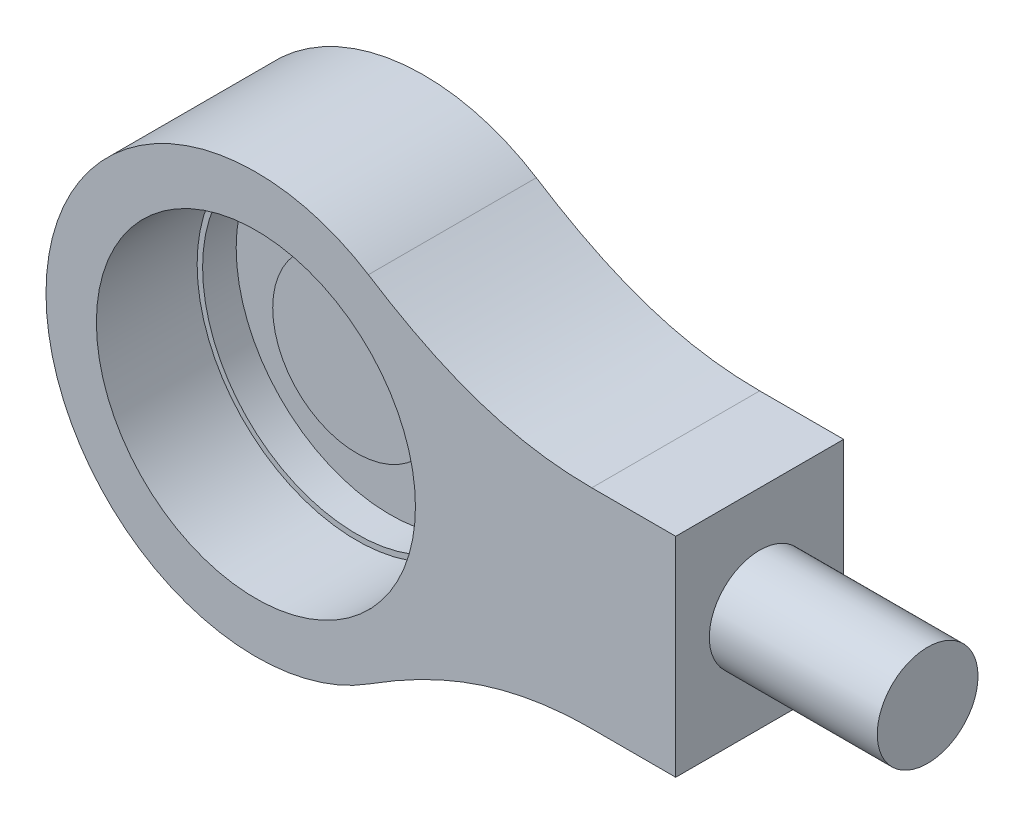
ISO-10303-21;
HEADER;
FILE_DESCRIPTION(('STEP AP214'),'2;1');
FILE_NAME('part.step','',(''),(''),'','','');
FILE_SCHEMA(('AUTOMOTIVE_DESIGN { 1 0 10303 214 1 1 1 1 }'));
ENDSEC;
DATA;
#1=APPLICATION_CONTEXT('core data for automotive mechanical design processes');
#2=APPLICATION_PROTOCOL_DEFINITION('international standard','automotive_design',2000,#1);
#3=PRODUCT_CONTEXT('',#1,'mechanical');
#4=PRODUCT('Part','Part','',(#3));
#5=PRODUCT_RELATED_PRODUCT_CATEGORY('part','',(#4));
#6=PRODUCT_DEFINITION_FORMATION('','',#4);
#7=PRODUCT_DEFINITION_CONTEXT('part definition',#1,'design');
#8=PRODUCT_DEFINITION('design','',#6,#7);
#9=PRODUCT_DEFINITION_SHAPE('','',#8);
#10=(LENGTH_UNIT() NAMED_UNIT(*) SI_UNIT(.MILLI.,.METRE.));
#11=(NAMED_UNIT(*) PLANE_ANGLE_UNIT() SI_UNIT($,.RADIAN.));
#12=(NAMED_UNIT(*) SI_UNIT($,.STERADIAN.) SOLID_ANGLE_UNIT());
#13=UNCERTAINTY_MEASURE_WITH_UNIT(LENGTH_MEASURE(1.E-05),#10,'distance_accuracy_value','');
#14=(GEOMETRIC_REPRESENTATION_CONTEXT(3) GLOBAL_UNCERTAINTY_ASSIGNED_CONTEXT((#13)) GLOBAL_UNIT_ASSIGNED_CONTEXT((#10,
#11,#12)) REPRESENTATION_CONTEXT('',''));
#15=CARTESIAN_POINT('',(0.,0.,0.));
#16=DIRECTION('',(0.,0.,1.));
#17=DIRECTION('',(1.,0.,0.));
#18=AXIS2_PLACEMENT_3D('',#15,#16,#17);
#19=CARTESIAN_POINT('',(0.,0.,10.));
#20=DIRECTION('',(0.,0.,-1.));
#21=DIRECTION('',(-1.,0.,0.));
#22=AXIS2_PLACEMENT_3D('',#19,#20,#21);
#23=CYLINDRICAL_SURFACE('',#22,9.5);
#24=CARTESIAN_POINT('',(0.,0.,10.));
#25=DIRECTION('',(0.,0.,1.));
#26=DIRECTION('',(1.,0.,0.));
#27=AXIS2_PLACEMENT_3D('',#24,#25,#26);
#28=CIRCLE('',#27,9.5);
#29=CARTESIAN_POINT('',(9.5,0.,10.));
#30=VERTEX_POINT('',#29);
#31=EDGE_CURVE('E162',#30,#30,#28,.T.);
#32=ORIENTED_EDGE('',*,*,#31,.T.);
#33=EDGE_LOOP('',(#32));
#34=FACE_BOUND('',#33,.T.);
#35=CARTESIAN_POINT('',(0.,0.,4.));
#36=DIRECTION('',(0.,0.,-1.));
#37=DIRECTION('',(-1.,0.,0.));
#38=AXIS2_PLACEMENT_3D('',#35,#36,#37);
#39=CIRCLE('',#38,9.5);
#40=CARTESIAN_POINT('',(-9.5,0.,4.));
#41=VERTEX_POINT('',#40);
#42=EDGE_CURVE('E172',#41,#41,#39,.T.);
#43=ORIENTED_EDGE('',*,*,#42,.T.);
#44=EDGE_LOOP('',(#43));
#45=FACE_BOUND('',#44,.T.);
#46=ADVANCED_FACE('F39',(#34,#45),#23,.F.);
#47=CARTESIAN_POINT('',(13.0195125977878,-7.38671214439234,10.));
#48=DIRECTION('',(0.,0.,-1.));
#49=DIRECTION('',(-1.,0.,0.));
#50=AXIS2_PLACEMENT_3D('',#47,#48,#49);
#51=PLANE('',#50);
#52=DIRECTION('',(0.,1.,0.));
#53=VECTOR('',#52,1.);
#54=CARTESIAN_POINT('',(25.,6.21521961013475,10.));
#55=LINE('',#54,#53);
#56=CARTESIAN_POINT('',(25.,-6.21521961013475,10.));
#57=VERTEX_POINT('',#56);
#58=CARTESIAN_POINT('',(25.,6.21521961013475,10.));
#59=VERTEX_POINT('',#58);
#60=EDGE_CURVE('E159',#57,#59,#55,.T.);
#61=ORIENTED_EDGE('',*,*,#60,.T.);
#62=DIRECTION('',(-1.,0.,0.));
#63=VECTOR('',#62,1.);
#64=CARTESIAN_POINT('',(20.,6.21521961013475,10.));
#65=LINE('',#64,#63);
#66=CARTESIAN_POINT('',(20.,6.21521961013475,10.));
#67=VERTEX_POINT('',#66);
#68=EDGE_CURVE('E95',#59,#67,#65,.T.);
#69=ORIENTED_EDGE('',*,*,#68,.T.);
#70=CARTESIAN_POINT('',(20.,6.21521961013475,10.));
#71=CARTESIAN_POINT('',(14.9280363965156,6.21521961013475,10.));
#72=CARTESIAN_POINT('',(10.8914547008877,7.89286266624097,10.));
#73=CARTESIAN_POINT('',(6.69762749009245,10.5542307158768,10.));
#74=B_SPLINE_CURVE_WITH_KNOTS('',3,(#70,#71,#72,#73),.UNSPECIFIED.,.F.,.F.,(4,4),(0.,1.),.UNSPECIFIED.);
#75=CARTESIAN_POINT('',(6.69762749009245,10.5542307158768,10.));
#76=VERTEX_POINT('',#75);
#77=EDGE_CURVE('E109',#67,#76,#74,.T.);
#78=ORIENTED_EDGE('',*,*,#77,.T.);
#79=CARTESIAN_POINT('',(0.,0.,10.));
#80=DIRECTION('',(0.,0.,1.));
#81=DIRECTION('',(1.,0.,0.));
#82=AXIS2_PLACEMENT_3D('',#79,#80,#81);
#83=CIRCLE('',#82,12.5);
#84=CARTESIAN_POINT('',(6.69762749009245,-10.5542307158768,10.));
#85=VERTEX_POINT('',#84);
#86=EDGE_CURVE('E102',#76,#85,#83,.T.);
#87=ORIENTED_EDGE('',*,*,#86,.T.);
#88=CARTESIAN_POINT('',(6.69762749009245,-10.5542307158768,10.));
#89=CARTESIAN_POINT('',(10.8914547008877,-7.89286266624097,10.));
#90=CARTESIAN_POINT('',(14.9280363965156,-6.21521961013475,10.));
#91=CARTESIAN_POINT('',(20.,-6.21521961013475,10.));
#92=B_SPLINE_CURVE_WITH_KNOTS('',3,(#88,#89,#90,#91),.UNSPECIFIED.,.F.,.F.,(4,4),(0.,1.),.UNSPECIFIED.);
#93=CARTESIAN_POINT('',(20.,-6.21521961013475,10.));
#94=VERTEX_POINT('',#93);
#95=EDGE_CURVE('E107',#85,#94,#92,.T.);
#96=ORIENTED_EDGE('',*,*,#95,.T.);
#97=DIRECTION('',(1.,0.,0.));
#98=VECTOR('',#97,1.);
#99=CARTESIAN_POINT('',(20.,-6.21521961013475,10.));
#100=LINE('',#99,#98);
#101=EDGE_CURVE('E58',#94,#57,#100,.T.);
#102=ORIENTED_EDGE('',*,*,#101,.T.);
#103=EDGE_LOOP('',(#61,#69,#78,#87,#96,#102));
#104=FACE_BOUND('',#103,.T.);
#105=ORIENTED_EDGE('',*,*,#31,.F.);
#106=EDGE_LOOP('',(#105));
#107=FACE_BOUND('',#106,.T.);
#108=ADVANCED_FACE('F104',(#104,#107),#51,.F.);
#109=CARTESIAN_POINT('',(13.0195125977878,-7.38671214439234,0.));
#110=DIRECTION('',(0.,0.,-1.));
#111=DIRECTION('',(-1.,0.,0.));
#112=AXIS2_PLACEMENT_3D('',#109,#110,#111);
#113=PLANE('',#112);
#114=CARTESIAN_POINT('',(6.69762749009245,-10.5542307158768,0.));
#115=CARTESIAN_POINT('',(10.8914547008877,-7.89286266624097,0.));
#116=CARTESIAN_POINT('',(14.9280363965156,-6.21521961013475,0.));
#117=CARTESIAN_POINT('',(20.,-6.21521961013475,0.));
#118=B_SPLINE_CURVE_WITH_KNOTS('',3,(#114,#115,#116,#117),.UNSPECIFIED.,.F.,.F.,(4,4),(0.,1.),.UNSPECIFIED.);
#119=CARTESIAN_POINT('',(6.69762749009245,-10.5542307158768,0.));
#120=VERTEX_POINT('',#119);
#121=CARTESIAN_POINT('',(20.,-6.21521961013475,0.));
#122=VERTEX_POINT('',#121);
#123=EDGE_CURVE('E80',#120,#122,#118,.T.);
#124=ORIENTED_EDGE('',*,*,#123,.F.);
#125=CARTESIAN_POINT('',(0.,0.,0.));
#126=DIRECTION('',(0.,0.,1.));
#127=DIRECTION('',(1.,0.,0.));
#128=AXIS2_PLACEMENT_3D('',#125,#126,#127);
#129=CIRCLE('',#128,12.5);
#130=CARTESIAN_POINT('',(6.69762749009245,10.5542307158768,0.));
#131=VERTEX_POINT('',#130);
#132=EDGE_CURVE('E118',#131,#120,#129,.T.);
#133=ORIENTED_EDGE('',*,*,#132,.F.);
#134=CARTESIAN_POINT('',(20.,6.21521961013475,0.));
#135=CARTESIAN_POINT('',(14.9280363965156,6.21521961013475,0.));
#136=CARTESIAN_POINT('',(10.8914547008877,7.89286266624097,0.));
#137=CARTESIAN_POINT('',(6.69762749009245,10.5542307158768,0.));
#138=B_SPLINE_CURVE_WITH_KNOTS('',3,(#134,#135,#136,#137),.UNSPECIFIED.,.F.,.F.,(4,4),(0.,1.),.UNSPECIFIED.);
#139=CARTESIAN_POINT('',(20.,6.21521961013475,0.));
#140=VERTEX_POINT('',#139);
#141=EDGE_CURVE('E206',#140,#131,#138,.T.);
#142=ORIENTED_EDGE('',*,*,#141,.F.);
#143=DIRECTION('',(-1.,0.,0.));
#144=VECTOR('',#143,1.);
#145=CARTESIAN_POINT('',(20.,6.21521961013475,0.));
#146=LINE('',#145,#144);
#147=CARTESIAN_POINT('',(25.,6.21521961013475,0.));
#148=VERTEX_POINT('',#147);
#149=EDGE_CURVE('E204',#148,#140,#146,.T.);
#150=ORIENTED_EDGE('',*,*,#149,.F.);
#151=DIRECTION('',(0.,1.,0.));
#152=VECTOR('',#151,1.);
#153=CARTESIAN_POINT('',(25.,6.21521961013475,0.));
#154=LINE('',#153,#152);
#155=CARTESIAN_POINT('',(25.,-6.21521961013475,0.));
#156=VERTEX_POINT('',#155);
#157=EDGE_CURVE('E166',#156,#148,#154,.T.);
#158=ORIENTED_EDGE('',*,*,#157,.F.);
#159=DIRECTION('',(1.,0.,0.));
#160=VECTOR('',#159,1.);
#161=CARTESIAN_POINT('',(20.,-6.21521961013475,0.));
#162=LINE('',#161,#160);
#163=EDGE_CURVE('E86',#122,#156,#162,.T.);
#164=ORIENTED_EDGE('',*,*,#163,.F.);
#165=EDGE_LOOP('',(#124,#133,#142,#150,#158,#164));
#166=FACE_BOUND('',#165,.T.);
#167=ADVANCED_FACE('F196',(#166),#113,.T.);
#168=CARTESIAN_POINT('',(25.,6.21521961013475,10.));
#169=DIRECTION('',(-1.,0.,0.));
#170=DIRECTION('',(0.,0.,1.));
#171=AXIS2_PLACEMENT_3D('',#168,#169,#170);
#172=PLANE('',#171);
#173=CARTESIAN_POINT('',(25.,0.,5.));
#174=DIRECTION('',(1.,0.,0.));
#175=DIRECTION('',(0.,0.,-1.));
#176=AXIS2_PLACEMENT_3D('',#173,#174,#175);
#177=CIRCLE('',#176,3.);
#178=CARTESIAN_POINT('',(25.,0.,2.));
#179=VERTEX_POINT('',#178);
#180=EDGE_CURVE('E11',#179,#179,#177,.T.);
#181=ORIENTED_EDGE('',*,*,#180,.F.);
#182=EDGE_LOOP('',(#181));
#183=FACE_BOUND('',#182,.T.);
#184=ORIENTED_EDGE('',*,*,#157,.T.);
#185=DIRECTION('',(0.,0.,-1.));
#186=VECTOR('',#185,1.);
#187=CARTESIAN_POINT('',(25.,6.21521961013475,10.));
#188=LINE('',#187,#186);
#189=EDGE_CURVE('E201',#59,#148,#188,.T.);
#190=ORIENTED_EDGE('',*,*,#189,.F.);
#191=ORIENTED_EDGE('',*,*,#60,.F.);
#192=DIRECTION('',(0.,0.,-1.));
#193=VECTOR('',#192,1.);
#194=CARTESIAN_POINT('',(25.,-6.21521961013475,10.));
#195=LINE('',#194,#193);
#196=EDGE_CURVE('E127',#57,#156,#195,.T.);
#197=ORIENTED_EDGE('',*,*,#196,.T.);
#198=EDGE_LOOP('',(#184,#190,#191,#197));
#199=FACE_BOUND('',#198,.T.);
#200=ADVANCED_FACE('F41',(#183,#199),#172,.F.);
#201=CARTESIAN_POINT('',(20.,6.21521961013475,10.));
#202=DIRECTION('',(0.,-1.,0.));
#203=DIRECTION('',(0.,0.,-1.));
#204=AXIS2_PLACEMENT_3D('',#201,#202,#203);
#205=PLANE('',#204);
#206=ORIENTED_EDGE('',*,*,#149,.T.);
#207=DIRECTION('',(0.,0.,-1.));
#208=VECTOR('',#207,1.);
#209=CARTESIAN_POINT('',(20.,6.21521961013475,10.));
#210=LINE('',#209,#208);
#211=EDGE_CURVE('E234',#67,#140,#210,.T.);
#212=ORIENTED_EDGE('',*,*,#211,.F.);
#213=ORIENTED_EDGE('',*,*,#68,.F.);
#214=ORIENTED_EDGE('',*,*,#189,.T.);
#215=EDGE_LOOP('',(#206,#212,#213,#214));
#216=FACE_BOUND('',#215,.T.);
#217=ADVANCED_FACE('F147',(#216),#205,.F.);
#218=DIRECTION('',(0.,0.,-1.));
#219=VECTOR('',#218,1.);
#220=SURFACE_OF_LINEAR_EXTRUSION('',#74,#219);
#221=ORIENTED_EDGE('',*,*,#141,.T.);
#222=DIRECTION('',(0.,0.,-1.));
#223=VECTOR('',#222,1.);
#224=CARTESIAN_POINT('',(6.69762749009245,10.5542307158768,10.));
#225=LINE('',#224,#223);
#226=EDGE_CURVE('E120',#76,#131,#225,.T.);
#227=ORIENTED_EDGE('',*,*,#226,.F.);
#228=ORIENTED_EDGE('',*,*,#77,.F.);
#229=ORIENTED_EDGE('',*,*,#211,.T.);
#230=EDGE_LOOP('',(#221,#227,#228,#229));
#231=FACE_BOUND('',#230,.T.);
#232=ADVANCED_FACE('F145',(#231),#220,.F.);
#233=CARTESIAN_POINT('',(0.,0.,10.));
#234=DIRECTION('',(0.,0.,-1.));
#235=DIRECTION('',(-1.,0.,0.));
#236=AXIS2_PLACEMENT_3D('',#233,#234,#235);
#237=CYLINDRICAL_SURFACE('',#236,12.5);
#238=ORIENTED_EDGE('',*,*,#132,.T.);
#239=DIRECTION('',(0.,0.,-1.));
#240=VECTOR('',#239,1.);
#241=CARTESIAN_POINT('',(6.69762749009245,-10.5542307158768,10.));
#242=LINE('',#241,#240);
#243=EDGE_CURVE('E115',#85,#120,#242,.T.);
#244=ORIENTED_EDGE('',*,*,#243,.F.);
#245=ORIENTED_EDGE('',*,*,#86,.F.);
#246=ORIENTED_EDGE('',*,*,#226,.T.);
#247=EDGE_LOOP('',(#238,#244,#245,#246));
#248=FACE_BOUND('',#247,.T.);
#249=ADVANCED_FACE('F116',(#248),#237,.T.);
#250=DIRECTION('',(0.,0.,-1.));
#251=VECTOR('',#250,1.);
#252=SURFACE_OF_LINEAR_EXTRUSION('',#92,#251);
#253=ORIENTED_EDGE('',*,*,#123,.T.);
#254=DIRECTION('',(0.,0.,-1.));
#255=VECTOR('',#254,1.);
#256=CARTESIAN_POINT('',(20.,-6.21521961013475,10.));
#257=LINE('',#256,#255);
#258=EDGE_CURVE('E121',#94,#122,#257,.T.);
#259=ORIENTED_EDGE('',*,*,#258,.F.);
#260=ORIENTED_EDGE('',*,*,#95,.F.);
#261=ORIENTED_EDGE('',*,*,#243,.T.);
#262=EDGE_LOOP('',(#253,#259,#260,#261));
#263=FACE_BOUND('',#262,.T.);
#264=ADVANCED_FACE('F123',(#263),#252,.F.);
#265=CARTESIAN_POINT('',(20.,-6.21521961013475,10.));
#266=DIRECTION('',(0.,1.,0.));
#267=DIRECTION('',(-1.,0.,0.));
#268=AXIS2_PLACEMENT_3D('',#265,#266,#267);
#269=PLANE('',#268);
#270=ORIENTED_EDGE('',*,*,#163,.T.);
#271=ORIENTED_EDGE('',*,*,#196,.F.);
#272=ORIENTED_EDGE('',*,*,#101,.F.);
#273=ORIENTED_EDGE('',*,*,#258,.T.);
#274=EDGE_LOOP('',(#270,#271,#272,#273));
#275=FACE_BOUND('',#274,.T.);
#276=ADVANCED_FACE('F141',(#275),#269,.F.);
#277=CARTESIAN_POINT('',(0.,0.,4.));
#278=DIRECTION('',(0.,0.,-1.));
#279=DIRECTION('',(-1.,0.,0.));
#280=AXIS2_PLACEMENT_3D('',#277,#278,#279);
#281=CYLINDRICAL_SURFACE('',#280,9.175);
#282=CARTESIAN_POINT('',(0.,0.,4.));
#283=DIRECTION('',(0.,0.,-1.));
#284=DIRECTION('',(-1.,0.,0.));
#285=AXIS2_PLACEMENT_3D('',#282,#283,#284);
#286=CIRCLE('',#285,9.175);
#287=CARTESIAN_POINT('',(-9.175,0.,4.));
#288=VERTEX_POINT('',#287);
#289=EDGE_CURVE('E176',#288,#288,#286,.T.);
#290=ORIENTED_EDGE('',*,*,#289,.F.);
#291=EDGE_LOOP('',(#290));
#292=FACE_BOUND('',#291,.T.);
#293=CARTESIAN_POINT('',(0.,0.,2.));
#294=DIRECTION('',(0.,0.,-1.));
#295=DIRECTION('',(-1.,0.,0.));
#296=AXIS2_PLACEMENT_3D('',#293,#294,#295);
#297=CIRCLE('',#296,9.175);
#298=CARTESIAN_POINT('',(-9.175,0.,2.));
#299=VERTEX_POINT('',#298);
#300=EDGE_CURVE('E43',#299,#299,#297,.T.);
#301=ORIENTED_EDGE('',*,*,#300,.T.);
#302=EDGE_LOOP('',(#301));
#303=FACE_BOUND('',#302,.T.);
#304=ADVANCED_FACE('F296',(#292,#303),#281,.F.);
#305=CARTESIAN_POINT('',(0.,0.,4.));
#306=DIRECTION('',(0.,0.,-1.));
#307=DIRECTION('',(-1.,0.,0.));
#308=AXIS2_PLACEMENT_3D('',#305,#306,#307);
#309=PLANE('',#308);
#310=ORIENTED_EDGE('',*,*,#42,.F.);
#311=EDGE_LOOP('',(#310));
#312=FACE_BOUND('',#311,.T.);
#313=ORIENTED_EDGE('',*,*,#289,.T.);
#314=EDGE_LOOP('',(#313));
#315=FACE_BOUND('',#314,.T.);
#316=ADVANCED_FACE('F255',(#312,#315),#309,.F.);
#317=CARTESIAN_POINT('',(0.,0.,4.));
#318=DIRECTION('',(0.,0.,-1.));
#319=DIRECTION('',(-1.,0.,0.));
#320=AXIS2_PLACEMENT_3D('',#317,#318,#319);
#321=PLANE('',#320);
#322=CARTESIAN_POINT('',(0.,0.,4.));
#323=DIRECTION('',(0.,0.,-1.));
#324=DIRECTION('',(-1.,0.,0.));
#325=AXIS2_PLACEMENT_3D('',#322,#323,#324);
#326=CIRCLE('',#325,5.);
#327=CARTESIAN_POINT('',(-5.,0.,4.));
#328=VERTEX_POINT('',#327);
#329=EDGE_CURVE('E168',#328,#328,#326,.T.);
#330=ORIENTED_EDGE('',*,*,#329,.F.);
#331=EDGE_LOOP('',(#330));
#332=FACE_BOUND('',#331,.T.);
#333=ADVANCED_FACE('F247',(#332),#321,.F.);
#334=CARTESIAN_POINT('',(0.,0.,4.));
#335=DIRECTION('',(0.,0.,-1.));
#336=DIRECTION('',(-1.,0.,0.));
#337=AXIS2_PLACEMENT_3D('',#334,#335,#336);
#338=CYLINDRICAL_SURFACE('',#337,5.);
#339=ORIENTED_EDGE('',*,*,#329,.T.);
#340=EDGE_LOOP('',(#339));
#341=FACE_BOUND('',#340,.T.);
#342=CARTESIAN_POINT('',(0.,0.,2.));
#343=DIRECTION('',(0.,0.,-1.));
#344=DIRECTION('',(-1.,0.,0.));
#345=AXIS2_PLACEMENT_3D('',#342,#343,#344);
#346=CIRCLE('',#345,5.);
#347=CARTESIAN_POINT('',(-5.,0.,2.));
#348=VERTEX_POINT('',#347);
#349=EDGE_CURVE('E167',#348,#348,#346,.T.);
#350=ORIENTED_EDGE('',*,*,#349,.F.);
#351=EDGE_LOOP('',(#350));
#352=FACE_BOUND('',#351,.T.);
#353=ADVANCED_FACE('F245',(#341,#352),#338,.T.);
#354=CARTESIAN_POINT('',(0.,0.,2.));
#355=DIRECTION('',(0.,0.,-1.));
#356=DIRECTION('',(-1.,0.,0.));
#357=AXIS2_PLACEMENT_3D('',#354,#355,#356);
#358=PLANE('',#357);
#359=ORIENTED_EDGE('',*,*,#349,.T.);
#360=EDGE_LOOP('',(#359));
#361=FACE_BOUND('',#360,.T.);
#362=ORIENTED_EDGE('',*,*,#300,.F.);
#363=EDGE_LOOP('',(#362));
#364=FACE_BOUND('',#363,.T.);
#365=ADVANCED_FACE('F190',(#361,#364),#358,.F.);
#366=CARTESIAN_POINT('',(35.,0.,5.));
#367=DIRECTION('',(-1.,0.,0.));
#368=DIRECTION('',(0.,0.,1.));
#369=AXIS2_PLACEMENT_3D('',#366,#367,#368);
#370=CYLINDRICAL_SURFACE('',#369,3.);
#371=CARTESIAN_POINT('',(35.,0.,5.));
#372=DIRECTION('',(1.,0.,0.));
#373=DIRECTION('',(0.,0.,-1.));
#374=AXIS2_PLACEMENT_3D('',#371,#372,#373);
#375=CIRCLE('',#374,3.);
#376=CARTESIAN_POINT('',(35.,0.,2.));
#377=VERTEX_POINT('',#376);
#378=EDGE_CURVE('E179',#377,#377,#375,.T.);
#379=ORIENTED_EDGE('',*,*,#378,.F.);
#380=EDGE_LOOP('',(#379));
#381=FACE_BOUND('',#380,.T.);
#382=ORIENTED_EDGE('',*,*,#180,.T.);
#383=EDGE_LOOP('',(#382));
#384=FACE_BOUND('',#383,.T.);
#385=ADVANCED_FACE('F187',(#381,#384),#370,.T.);
#386=CARTESIAN_POINT('',(35.,0.,5.));
#387=DIRECTION('',(1.,0.,0.));
#388=DIRECTION('',(0.,0.,-1.));
#389=AXIS2_PLACEMENT_3D('',#386,#387,#388);
#390=PLANE('',#389);
#391=ORIENTED_EDGE('',*,*,#378,.T.);
#392=EDGE_LOOP('',(#391));
#393=FACE_BOUND('',#392,.T.);
#394=ADVANCED_FACE('F185',(#393),#390,.T.);
#395=CLOSED_SHELL('',(#46,#108,#167,#200,#217,#232,#249,#264,#276,#304,#316,#333,#353,#365,#385,#394));
#396=MANIFOLD_SOLID_BREP('B2',#395);
#397=ADVANCED_BREP_SHAPE_REPRESENTATION('',(#18,#396),#14);
#398=SHAPE_DEFINITION_REPRESENTATION(#9,#397);
ENDSEC;
END-ISO-10303-21;
